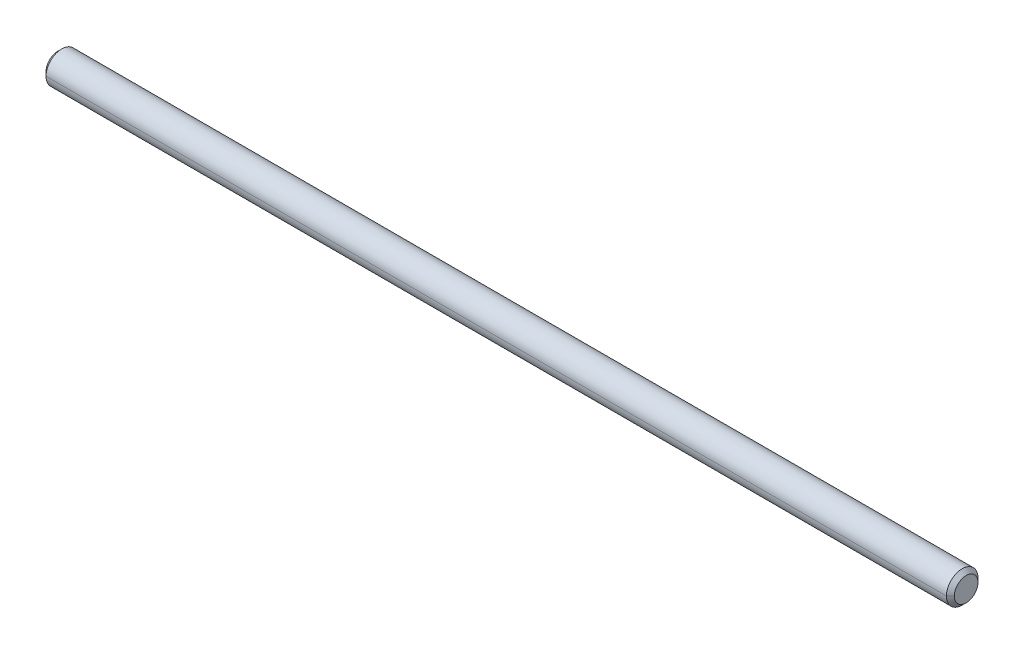
ISO-10303-21;
HEADER;
FILE_DESCRIPTION(('STEP AP214'),'2;1');
FILE_NAME('part.step','',(''),(''),'','','');
FILE_SCHEMA(('AUTOMOTIVE_DESIGN { 1 0 10303 214 1 1 1 1 }'));
ENDSEC;
DATA;
#1=APPLICATION_CONTEXT('core data for automotive mechanical design processes');
#2=APPLICATION_PROTOCOL_DEFINITION('international standard','automotive_design',2000,#1);
#3=PRODUCT_CONTEXT('',#1,'mechanical');
#4=PRODUCT('Part','Part','',(#3));
#5=PRODUCT_RELATED_PRODUCT_CATEGORY('part','',(#4));
#6=PRODUCT_DEFINITION_FORMATION('','',#4);
#7=PRODUCT_DEFINITION_CONTEXT('part definition',#1,'design');
#8=PRODUCT_DEFINITION('design','',#6,#7);
#9=PRODUCT_DEFINITION_SHAPE('','',#8);
#10=(LENGTH_UNIT() NAMED_UNIT(*) SI_UNIT(.MILLI.,.METRE.));
#11=(NAMED_UNIT(*) PLANE_ANGLE_UNIT() SI_UNIT($,.RADIAN.));
#12=(NAMED_UNIT(*) SI_UNIT($,.STERADIAN.) SOLID_ANGLE_UNIT());
#13=UNCERTAINTY_MEASURE_WITH_UNIT(LENGTH_MEASURE(1.E-05),#10,'distance_accuracy_value','');
#14=(GEOMETRIC_REPRESENTATION_CONTEXT(3) GLOBAL_UNCERTAINTY_ASSIGNED_CONTEXT((#13)) GLOBAL_UNIT_ASSIGNED_CONTEXT((#10,
#11,#12)) REPRESENTATION_CONTEXT('',''));
#15=CARTESIAN_POINT('',(0.,0.,0.));
#16=DIRECTION('',(0.,0.,1.));
#17=DIRECTION('',(1.,0.,0.));
#18=AXIS2_PLACEMENT_3D('',#15,#16,#17);
#19=CARTESIAN_POINT('',(115.,0.,0.));
#20=DIRECTION('',(-1.,0.,0.));
#21=DIRECTION('',(0.,0.,1.));
#22=AXIS2_PLACEMENT_3D('',#19,#20,#21);
#23=PLANE('',#22);
#24=CARTESIAN_POINT('',(115.,0.,0.));
#25=DIRECTION('',(-1.,0.,0.));
#26=DIRECTION('',(0.,0.,1.));
#27=AXIS2_PLACEMENT_3D('',#24,#25,#26);
#28=CIRCLE('',#27,3.);
#29=CARTESIAN_POINT('',(115.,0.,3.));
#30=VERTEX_POINT('',#29);
#31=CARTESIAN_POINT('',(115.,0.,-3.));
#32=VERTEX_POINT('',#31);
#33=EDGE_CURVE('E122',#30,#32,#28,.T.);
#34=ORIENTED_EDGE('',*,*,#33,.F.);
#35=CARTESIAN_POINT('',(115.,0.,0.));
#36=DIRECTION('',(-1.,0.,0.));
#37=DIRECTION('',(0.,0.,1.));
#38=AXIS2_PLACEMENT_3D('',#35,#36,#37);
#39=CIRCLE('',#38,3.);
#40=EDGE_CURVE('E11',#32,#30,#39,.T.);
#41=ORIENTED_EDGE('',*,*,#40,.F.);
#42=EDGE_LOOP('',(#34,#41));
#43=FACE_BOUND('',#42,.T.);
#44=ADVANCED_FACE('F16',(#43),#23,.F.);
#45=CARTESIAN_POINT('',(115.,0.,0.));
#46=DIRECTION('',(-1.,0.,0.));
#47=DIRECTION('',(0.,0.,1.));
#48=AXIS2_PLACEMENT_3D('',#45,#46,#47);
#49=CONICAL_SURFACE('',#48,3.,0.785398163397448);
#50=DIRECTION('',(-0.707106781186548,0.,-0.707106781186547));
#51=VECTOR('',#50,1.);
#52=CARTESIAN_POINT('',(115.,0.,-3.));
#53=LINE('',#52,#51);
#54=CARTESIAN_POINT('',(114.,0.,-4.));
#55=VERTEX_POINT('',#54);
#56=EDGE_CURVE('E117',#32,#55,#53,.T.);
#57=ORIENTED_EDGE('',*,*,#56,.F.);
#58=ORIENTED_EDGE('',*,*,#40,.T.);
#59=DIRECTION('',(-0.707106781186548,0.,0.707106781186547));
#60=VECTOR('',#59,1.);
#61=CARTESIAN_POINT('',(115.,0.,3.));
#62=LINE('',#61,#60);
#63=CARTESIAN_POINT('',(114.,0.,4.));
#64=VERTEX_POINT('',#63);
#65=EDGE_CURVE('E109',#30,#64,#62,.T.);
#66=ORIENTED_EDGE('',*,*,#65,.T.);
#67=CARTESIAN_POINT('',(114.,0.,0.));
#68=DIRECTION('',(-1.,0.,0.));
#69=DIRECTION('',(0.,0.,1.));
#70=AXIS2_PLACEMENT_3D('',#67,#68,#69);
#71=CIRCLE('',#70,4.);
#72=EDGE_CURVE('E27',#55,#64,#71,.T.);
#73=ORIENTED_EDGE('',*,*,#72,.F.);
#74=EDGE_LOOP('',(#57,#58,#66,#73));
#75=FACE_BOUND('',#74,.T.);
#76=ADVANCED_FACE('F138',(#75),#49,.T.);
#77=CARTESIAN_POINT('',(-115.,0.,0.));
#78=DIRECTION('',(-1.,0.,0.));
#79=DIRECTION('',(0.,0.,1.));
#80=AXIS2_PLACEMENT_3D('',#77,#78,#79);
#81=CYLINDRICAL_SURFACE('',#80,4.);
#82=DIRECTION('',(-1.,0.,0.));
#83=VECTOR('',#82,1.);
#84=CARTESIAN_POINT('',(-115.,0.,-4.));
#85=LINE('',#84,#83);
#86=CARTESIAN_POINT('',(-114.,0.,-4.));
#87=VERTEX_POINT('',#86);
#88=EDGE_CURVE('E103',#55,#87,#85,.T.);
#89=ORIENTED_EDGE('',*,*,#88,.F.);
#90=ORIENTED_EDGE('',*,*,#72,.T.);
#91=DIRECTION('',(-1.,0.,0.));
#92=VECTOR('',#91,1.);
#93=CARTESIAN_POINT('',(-115.,0.,4.));
#94=LINE('',#93,#92);
#95=CARTESIAN_POINT('',(-114.,0.,4.));
#96=VERTEX_POINT('',#95);
#97=EDGE_CURVE('E20',#64,#96,#94,.T.);
#98=ORIENTED_EDGE('',*,*,#97,.T.);
#99=CARTESIAN_POINT('',(-114.,0.,0.));
#100=DIRECTION('',(-1.,0.,0.));
#101=DIRECTION('',(0.,0.,1.));
#102=AXIS2_PLACEMENT_3D('',#99,#100,#101);
#103=CIRCLE('',#102,4.);
#104=EDGE_CURVE('E81',#87,#96,#103,.T.);
#105=ORIENTED_EDGE('',*,*,#104,.F.);
#106=EDGE_LOOP('',(#89,#90,#98,#105));
#107=FACE_BOUND('',#106,.T.);
#108=ADVANCED_FACE('F98',(#107),#81,.T.);
#109=CARTESIAN_POINT('',(-114.,0.,0.));
#110=DIRECTION('',(1.,0.,0.));
#111=DIRECTION('',(0.,0.,-1.));
#112=AXIS2_PLACEMENT_3D('',#109,#110,#111);
#113=CONICAL_SURFACE('',#112,4.,0.785398163397448);
#114=DIRECTION('',(0.707106781186548,0.,0.707106781186547));
#115=VECTOR('',#114,1.);
#116=CARTESIAN_POINT('',(-114.,0.,4.));
#117=LINE('',#116,#115);
#118=CARTESIAN_POINT('',(-115.,0.,3.));
#119=VERTEX_POINT('',#118);
#120=EDGE_CURVE('E84',#119,#96,#117,.T.);
#121=ORIENTED_EDGE('',*,*,#120,.F.);
#122=CARTESIAN_POINT('',(-115.,0.,0.));
#123=DIRECTION('',(-1.,0.,0.));
#124=DIRECTION('',(0.,0.,1.));
#125=AXIS2_PLACEMENT_3D('',#122,#123,#124);
#126=CIRCLE('',#125,3.);
#127=CARTESIAN_POINT('',(-115.,0.,-3.));
#128=VERTEX_POINT('',#127);
#129=EDGE_CURVE('E42',#128,#119,#126,.T.);
#130=ORIENTED_EDGE('',*,*,#129,.F.);
#131=DIRECTION('',(0.707106781186548,0.,-0.707106781186547));
#132=VECTOR('',#131,1.);
#133=CARTESIAN_POINT('',(-114.,0.,-4.));
#134=LINE('',#133,#132);
#135=EDGE_CURVE('E86',#128,#87,#134,.T.);
#136=ORIENTED_EDGE('',*,*,#135,.T.);
#137=ORIENTED_EDGE('',*,*,#104,.T.);
#138=EDGE_LOOP('',(#121,#130,#136,#137));
#139=FACE_BOUND('',#138,.T.);
#140=ADVANCED_FACE('F83',(#139),#113,.T.);
#141=CARTESIAN_POINT('',(-115.,0.,0.));
#142=DIRECTION('',(1.,0.,0.));
#143=DIRECTION('',(0.,1.,0.));
#144=AXIS2_PLACEMENT_3D('',#141,#142,#143);
#145=PLANE('',#144);
#146=ORIENTED_EDGE('',*,*,#129,.T.);
#147=CARTESIAN_POINT('',(-115.,0.,0.));
#148=DIRECTION('',(-1.,0.,0.));
#149=DIRECTION('',(0.,0.,1.));
#150=AXIS2_PLACEMENT_3D('',#147,#148,#149);
#151=CIRCLE('',#150,3.);
#152=EDGE_CURVE('E95',#119,#128,#151,.T.);
#153=ORIENTED_EDGE('',*,*,#152,.T.);
#154=EDGE_LOOP('',(#146,#153));
#155=FACE_BOUND('',#154,.T.);
#156=ADVANCED_FACE('F149',(#155),#145,.F.);
#157=CARTESIAN_POINT('',(-114.,0.,0.));
#158=DIRECTION('',(1.,0.,0.));
#159=DIRECTION('',(0.,0.,-1.));
#160=AXIS2_PLACEMENT_3D('',#157,#158,#159);
#161=CONICAL_SURFACE('',#160,4.,0.785398163397448);
#162=ORIENTED_EDGE('',*,*,#152,.F.);
#163=ORIENTED_EDGE('',*,*,#120,.T.);
#164=CARTESIAN_POINT('',(-114.,0.,0.));
#165=DIRECTION('',(-1.,0.,0.));
#166=DIRECTION('',(0.,0.,1.));
#167=AXIS2_PLACEMENT_3D('',#164,#165,#166);
#168=CIRCLE('',#167,4.);
#169=EDGE_CURVE('E92',#96,#87,#168,.T.);
#170=ORIENTED_EDGE('',*,*,#169,.T.);
#171=ORIENTED_EDGE('',*,*,#135,.F.);
#172=EDGE_LOOP('',(#162,#163,#170,#171));
#173=FACE_BOUND('',#172,.T.);
#174=ADVANCED_FACE('F18',(#173),#161,.T.);
#175=CARTESIAN_POINT('',(-115.,0.,0.));
#176=DIRECTION('',(-1.,0.,0.));
#177=DIRECTION('',(0.,0.,1.));
#178=AXIS2_PLACEMENT_3D('',#175,#176,#177);
#179=CYLINDRICAL_SURFACE('',#178,4.);
#180=CARTESIAN_POINT('',(114.,0.,0.));
#181=DIRECTION('',(-1.,0.,0.));
#182=DIRECTION('',(0.,0.,1.));
#183=AXIS2_PLACEMENT_3D('',#180,#181,#182);
#184=CIRCLE('',#183,4.);
#185=EDGE_CURVE('E121',#64,#55,#184,.T.);
#186=ORIENTED_EDGE('',*,*,#185,.T.);
#187=ORIENTED_EDGE('',*,*,#88,.T.);
#188=ORIENTED_EDGE('',*,*,#169,.F.);
#189=ORIENTED_EDGE('',*,*,#97,.F.);
#190=EDGE_LOOP('',(#186,#187,#188,#189));
#191=FACE_BOUND('',#190,.T.);
#192=ADVANCED_FACE('F102',(#191),#179,.T.);
#193=CARTESIAN_POINT('',(115.,0.,0.));
#194=DIRECTION('',(-1.,0.,0.));
#195=DIRECTION('',(0.,0.,1.));
#196=AXIS2_PLACEMENT_3D('',#193,#194,#195);
#197=CONICAL_SURFACE('',#196,3.,0.785398163397448);
#198=ORIENTED_EDGE('',*,*,#33,.T.);
#199=ORIENTED_EDGE('',*,*,#56,.T.);
#200=ORIENTED_EDGE('',*,*,#185,.F.);
#201=ORIENTED_EDGE('',*,*,#65,.F.);
#202=EDGE_LOOP('',(#198,#199,#200,#201));
#203=FACE_BOUND('',#202,.T.);
#204=ADVANCED_FACE('F135',(#203),#197,.T.);
#205=CLOSED_SHELL('',(#44,#76,#108,#140,#156,#174,#192,#204));
#206=MANIFOLD_SOLID_BREP('B1',#205);
#207=ADVANCED_BREP_SHAPE_REPRESENTATION('',(#18,#206),#14);
#208=SHAPE_DEFINITION_REPRESENTATION(#9,#207);
ENDSEC;
END-ISO-10303-21;
